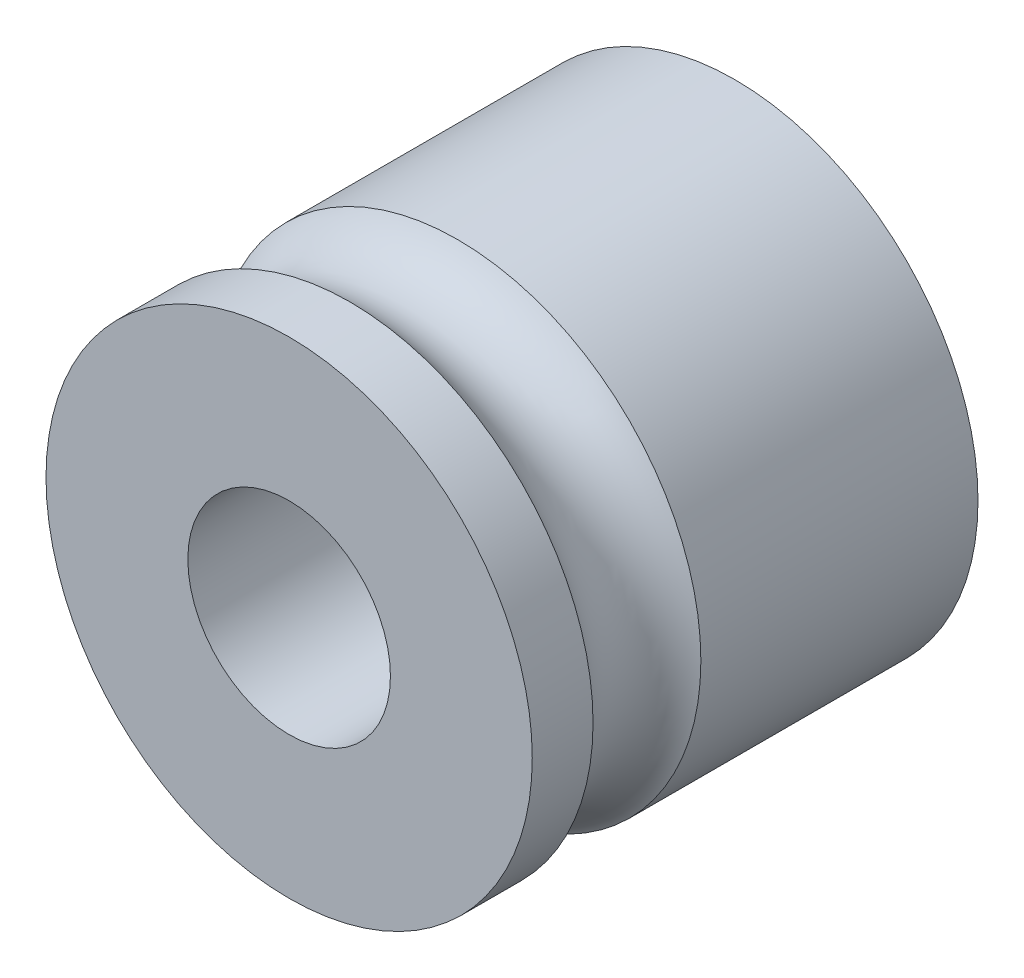
ISO-10303-21;
HEADER;
FILE_DESCRIPTION(('STEP AP214'),'2;1');
FILE_NAME('part.step','',(''),(''),'','','');
FILE_SCHEMA(('AUTOMOTIVE_DESIGN { 1 0 10303 214 1 1 1 1 }'));
ENDSEC;
DATA;
#1=APPLICATION_CONTEXT('core data for automotive mechanical design processes');
#2=APPLICATION_PROTOCOL_DEFINITION('international standard','automotive_design',2000,#1);
#3=PRODUCT_CONTEXT('',#1,'mechanical');
#4=PRODUCT('Part','Part','',(#3));
#5=PRODUCT_RELATED_PRODUCT_CATEGORY('part','',(#4));
#6=PRODUCT_DEFINITION_FORMATION('','',#4);
#7=PRODUCT_DEFINITION_CONTEXT('part definition',#1,'design');
#8=PRODUCT_DEFINITION('design','',#6,#7);
#9=PRODUCT_DEFINITION_SHAPE('','',#8);
#10=(LENGTH_UNIT() NAMED_UNIT(*) SI_UNIT(.MILLI.,.METRE.));
#11=(NAMED_UNIT(*) PLANE_ANGLE_UNIT() SI_UNIT($,.RADIAN.));
#12=(NAMED_UNIT(*) SI_UNIT($,.STERADIAN.) SOLID_ANGLE_UNIT());
#13=UNCERTAINTY_MEASURE_WITH_UNIT(LENGTH_MEASURE(1.E-05),#10,'distance_accuracy_value','');
#14=(GEOMETRIC_REPRESENTATION_CONTEXT(3) GLOBAL_UNCERTAINTY_ASSIGNED_CONTEXT((#13)) GLOBAL_UNIT_ASSIGNED_CONTEXT((#10,
#11,#12)) REPRESENTATION_CONTEXT('',''));
#15=CARTESIAN_POINT('',(0.,0.,0.));
#16=DIRECTION('',(0.,0.,1.));
#17=DIRECTION('',(1.,0.,0.));
#18=AXIS2_PLACEMENT_3D('',#15,#16,#17);
#19=CARTESIAN_POINT('',(0.,0.,11.));
#20=DIRECTION('',(0.,0.,-1.));
#21=DIRECTION('',(-1.,0.,0.));
#22=AXIS2_PLACEMENT_3D('',#19,#20,#21);
#23=CYLINDRICAL_SURFACE('',#22,6.);
#24=CARTESIAN_POINT('',(-6.,0.,4.20987199118622));
#25=CARTESIAN_POINT('',(-5.99999859868013,-0.0828760886697311,4.20986966544806));
#26=CARTESIAN_POINT('',(-5.99826578131828,-0.165778157830763,4.20298044041243));
#27=CARTESIAN_POINT('',(-5.99152113829892,-0.329206323770533,4.17564683987921));
#28=CARTESIAN_POINT('',(-5.98650745419968,-0.409731046870739,4.15519478164837));
#29=CARTESIAN_POINT('',(-5.9737562633204,-0.566020872182577,4.10143273772413));
#30=CARTESIAN_POINT('',(-5.96602202842087,-0.641791563430003,4.06813819247094));
#31=CARTESIAN_POINT('',(-5.94865343807593,-0.786672131904427,3.98969060114139));
#32=CARTESIAN_POINT('',(-5.9390190185405,-0.85578178434876,3.94453715506728));
#33=CARTESIAN_POINT('',(-5.91867413591801,-0.98680192730092,3.84267120153201));
#34=CARTESIAN_POINT('',(-5.90794707148533,-1.04855569006107,3.78576041622704));
#35=CARTESIAN_POINT('',(-5.8867362011753,-1.1617489272033,3.6624197862773));
#36=CARTESIAN_POINT('',(-5.87625242288348,-1.21318723694913,3.59598886823972));
#37=CARTESIAN_POINT('',(-5.8565477569971,-1.30502654279903,3.45427676444878));
#38=CARTESIAN_POINT('',(-5.84734794470605,-1.34525221592536,3.37887876037582));
#39=CARTESIAN_POINT('',(-5.83149494812223,-1.41239690855053,3.22212357952786));
#40=CARTESIAN_POINT('',(-5.82484135672789,-1.43931805543933,3.14076735786046));
#41=CARTESIAN_POINT('',(-5.81500476717551,-1.47855483680429,2.97612849298374));
#42=CARTESIAN_POINT('',(-5.81175491075426,-1.49115226833334,2.89291709513642));
#43=CARTESIAN_POINT('',(-5.80889362537741,-1.50226177506785,2.72550342217224));
#44=CARTESIAN_POINT('',(-5.80928160448644,-1.50077614181798,2.64130131048761));
#45=CARTESIAN_POINT('',(-5.81359205496618,-1.48398652463928,2.47645618344174));
#46=CARTESIAN_POINT('',(-5.81742863001879,-1.46901834019052,2.39577636972112));
#47=CARTESIAN_POINT('',(-5.82806709676484,-1.42622418690311,2.23811094027493));
#48=CARTESIAN_POINT('',(-5.83486919970696,-1.39839730206942,2.16112558815723));
#49=CARTESIAN_POINT('',(-5.85075113904187,-1.33038947793715,2.01213397493415));
#50=CARTESIAN_POINT('',(-5.85985327469421,-1.29008666723291,1.94018581939667));
#51=CARTESIAN_POINT('',(-5.87929710846386,-1.19835627601495,1.80395328142938));
#52=CARTESIAN_POINT('',(-5.88963902334735,-1.14692674880884,1.73967024311896));
#53=CARTESIAN_POINT('',(-5.91075880539781,-1.03266342468122,1.61866837549182));
#54=CARTESIAN_POINT('',(-5.92154069477971,-0.969546258165859,1.56221750112487));
#55=CARTESIAN_POINT('',(-5.94205965578786,-0.8346119175037,1.46065074872231));
#56=CARTESIAN_POINT('',(-5.95179669549415,-0.762794477707943,1.41553521692265));
#57=CARTESIAN_POINT('',(-5.96917732094183,-0.612115888681391,1.33782140496183));
#58=CARTESIAN_POINT('',(-5.97681360127725,-0.533231393208623,1.30526665093179));
#59=CARTESIAN_POINT('',(-5.98907916991419,-0.370876008142883,1.25395468547665));
#60=CARTESIAN_POINT('',(-5.99370903339281,-0.287405999150484,1.23519483476808));
#61=CARTESIAN_POINT('',(-5.99935499271375,-0.120539970390026,1.21241442562738));
#62=CARTESIAN_POINT('',(-6.00046053508279,-0.0371967199882089,1.20802896511092));
#63=CARTESIAN_POINT('',(-5.99918804814451,0.129032874801509,1.21312099324171));
#64=CARTESIAN_POINT('',(-5.99681033241847,0.211919259644596,1.22259723398535));
#65=CARTESIAN_POINT('',(-5.98889581127357,0.373614268776492,1.2548428995776));
#66=CARTESIAN_POINT('',(-5.98340634185811,0.452465118968755,1.27741325466321));
#67=CARTESIAN_POINT('',(-5.96988706634134,0.605257292452512,1.33497907521467));
#68=CARTESIAN_POINT('',(-5.96185700369892,0.679198119032635,1.36997579549939));
#69=CARTESIAN_POINT('',(-5.94393307926311,0.821523134429848,1.45210812006095));
#70=CARTESIAN_POINT('',(-5.93400867366932,0.889785441835831,1.49944810358298));
#71=CARTESIAN_POINT('',(-5.91344509187419,1.01752661364325,1.60466189998319));
#72=CARTESIAN_POINT('',(-5.90280579251705,1.07700395897301,1.66253753080313));
#73=CARTESIAN_POINT('',(-5.88168956960771,1.18699056807273,1.78887395203068));
#74=CARTESIAN_POINT('',(-5.87122304187281,1.23724386762203,1.85755969418864));
#75=CARTESIAN_POINT('',(-5.85192878377239,1.3255107590127,2.00260462565194));
#76=CARTESIAN_POINT('',(-5.84310098067026,1.36352489415794,2.07896347414597));
#77=CARTESIAN_POINT('',(-5.82818094734665,1.42595142060929,2.2367777135993));
#78=CARTESIAN_POINT('',(-5.82207255291906,1.45044439665407,2.31819961953023));
#79=CARTESIAN_POINT('',(-5.81326744090184,1.48534565995378,2.48418162907533));
#80=CARTESIAN_POINT('',(-5.81056997719936,1.49575702747866,2.56874104221871));
#81=CARTESIAN_POINT('',(-5.80894901203957,1.50203859033399,2.73599301504142));
#82=CARTESIAN_POINT('',(-5.80991932728264,1.49831789778012,2.81866942631095));
#83=CARTESIAN_POINT('',(-5.81527909007843,1.47737727831287,2.9821758798542));
#84=CARTESIAN_POINT('',(-5.81966846891857,1.46015762268677,3.06300595919987));
#85=CARTESIAN_POINT('',(-5.83131260682723,1.41293131944279,3.22008045025163));
#86=CARTESIAN_POINT('',(-5.8385501523631,1.38300140468038,3.29634929642643));
#87=CARTESIAN_POINT('',(-5.85507755724829,1.31126491360507,3.44283737389991));
#88=CARTESIAN_POINT('',(-5.86436770120773,1.26945669003419,3.51305576437314));
#89=CARTESIAN_POINT('',(-5.88425634263512,1.17386774863714,3.64742662018824));
#90=CARTESIAN_POINT('',(-5.89488264831757,1.11980316291225,3.71137306461018));
#91=CARTESIAN_POINT('',(-5.91608027246286,1.00178937118973,3.82941903598163));
#92=CARTESIAN_POINT('',(-5.9266515772706,0.937837821261145,3.88351622129919));
#93=CARTESIAN_POINT('',(-5.94677655647663,0.800467586702589,3.98128329975083));
#94=CARTESIAN_POINT('',(-5.95630833365868,0.726898422316385,4.0247466048578));
#95=CARTESIAN_POINT('',(-5.97304924975118,0.573266059510474,4.09861945412675));
#96=CARTESIAN_POINT('',(-5.98026005199781,0.493207563436738,4.12903835183476));
#97=CARTESIAN_POINT('',(-5.99048059565542,0.34441025324347,4.17144382151587));
#98=CARTESIAN_POINT('',(-5.99402585052691,0.276380170908067,4.18582323423965));
#99=CARTESIAN_POINT('',(-5.99878605231948,0.138906071536282,4.20503793480816));
#100=CARTESIAN_POINT('',(-6.00000117450894,0.0694621612426158,4.20987394049152));
#101=CARTESIAN_POINT('',(-6.,0.,4.20987199118622));
#102=B_SPLINE_CURVE_WITH_KNOTS('',3,(#24,#25,#26,#27,#28,#29,#30,#31,#32,#33,#34,#35,#36,#37,
#38,#39,#40,#41,#42,#43,#44,#45,#46,#47,#48,#49,#50,#51,#52,#53,#54,#55,#56,#57,#58,#59,#60,#61,
#62,#63,#64,#65,#66,#67,#68,#69,#70,#71,#72,#73,#74,#75,#76,#77,#78,#79,#80,#81,#82,#83,#84,#85,
#86,#87,#88,#89,#90,#91,#92,#93,#94,#95,#96,#97,#98,#99,#100,#101),.UNSPECIFIED.,.T.,.F.,(4,2,2,
2,2,2,2,2,2,2,2,2,2,2,2,2,2,2,2,2,2,2,2,2,2,2,2,2,2,2,2,2,2,2,2,2,2,2,4),(0.,0.24837371247189,
0.4968882377639,0.745104902286106,0.993329940169328,1.24614435437139,1.49898729580062,
1.75558647545807,2.01214461169368,2.2635629509943,2.51494038112697,2.76022497007018,
3.00552703466038,3.25330527873879,3.50112690836163,3.75601500969019,4.01091089558247,
4.26668229009114,4.52240473688643,4.77158308949276,5.02073901112743,5.26620274514037,
5.5116912732229,5.76153587565352,6.01142363008019,6.26744509204476,6.52345518749508,
6.77792254614037,7.03233423252408,7.27943780398613,7.52653640956034,7.77216400559447,
8.01782568136901,8.2698957640991,8.52202569770418,8.77872185499588,9.0352336382135,
9.24342242942149,9.4515955604304),.UNSPECIFIED.);
#103=CARTESIAN_POINT('',(-6.,0.,4.20987199118622));
#104=VERTEX_POINT('',#103);
#105=EDGE_CURVE('E73',#104,#104,#102,.T.);
#106=ORIENTED_EDGE('',*,*,#105,.T.);
#107=EDGE_LOOP('',(#106));
#108=FACE_BOUND('',#107,.T.);
#109=CARTESIAN_POINT('',(0.,0.,6.83891077757858));
#110=DIRECTION('',(0.,0.,-1.));
#111=DIRECTION('',(-1.,0.,0.));
#112=AXIS2_PLACEMENT_3D('',#109,#110,#111);
#113=CIRCLE('',#112,6.);
#114=CARTESIAN_POINT('',(-6.,0.,6.83891077757858));
#115=VERTEX_POINT('',#114);
#116=EDGE_CURVE('E65',#115,#115,#113,.T.);
#117=ORIENTED_EDGE('',*,*,#116,.T.);
#118=EDGE_LOOP('',(#117));
#119=FACE_BOUND('',#118,.T.);
#120=CARTESIAN_POINT('',(0.,0.,0.));
#121=DIRECTION('',(0.,0.,1.));
#122=DIRECTION('',(1.,0.,0.));
#123=AXIS2_PLACEMENT_3D('',#120,#121,#122);
#124=CIRCLE('',#123,6.);
#125=CARTESIAN_POINT('',(6.,0.,0.));
#126=VERTEX_POINT('',#125);
#127=EDGE_CURVE('E55',#126,#126,#124,.T.);
#128=ORIENTED_EDGE('',*,*,#127,.T.);
#129=EDGE_LOOP('',(#128));
#130=FACE_BOUND('',#129,.T.);
#131=ADVANCED_FACE('F42',(#108,#119,#130),#23,.T.);
#132=CARTESIAN_POINT('',(0.,0.,11.));
#133=DIRECTION('',(0.,0.,1.));
#134=DIRECTION('',(1.,0.,0.));
#135=AXIS2_PLACEMENT_3D('',#132,#133,#134);
#136=PLANE('',#135);
#137=CARTESIAN_POINT('',(0.,0.,11.));
#138=DIRECTION('',(0.,0.,1.));
#139=DIRECTION('',(1.,0.,0.));
#140=AXIS2_PLACEMENT_3D('',#137,#138,#139);
#141=CIRCLE('',#140,6.);
#142=CARTESIAN_POINT('',(6.,0.,11.));
#143=VERTEX_POINT('',#142);
#144=EDGE_CURVE('E12',#143,#143,#141,.T.);
#145=ORIENTED_EDGE('',*,*,#144,.T.);
#146=EDGE_LOOP('',(#145));
#147=FACE_BOUND('',#146,.T.);
#148=CARTESIAN_POINT('',(0.,0.,11.));
#149=DIRECTION('',(0.,0.,1.));
#150=DIRECTION('',(1.,0.,0.));
#151=AXIS2_PLACEMENT_3D('',#148,#149,#150);
#152=CIRCLE('',#151,2.5);
#153=CARTESIAN_POINT('',(2.5,0.,11.));
#154=VERTEX_POINT('',#153);
#155=EDGE_CURVE('E60',#154,#154,#152,.T.);
#156=ORIENTED_EDGE('',*,*,#155,.F.);
#157=EDGE_LOOP('',(#156));
#158=FACE_BOUND('',#157,.T.);
#159=ADVANCED_FACE('F91',(#147,#158),#136,.T.);
#160=CARTESIAN_POINT('',(0.,0.,0.));
#161=DIRECTION('',(0.,0.,1.));
#162=DIRECTION('',(1.,0.,0.));
#163=AXIS2_PLACEMENT_3D('',#160,#161,#162);
#164=PLANE('',#163);
#165=ORIENTED_EDGE('',*,*,#127,.F.);
#166=EDGE_LOOP('',(#165));
#167=FACE_BOUND('',#166,.T.);
#168=CARTESIAN_POINT('',(0.,0.,0.));
#169=DIRECTION('',(0.,0.,1.));
#170=DIRECTION('',(1.,0.,0.));
#171=AXIS2_PLACEMENT_3D('',#168,#169,#170);
#172=CIRCLE('',#171,2.5);
#173=CARTESIAN_POINT('',(2.5,0.,0.));
#174=VERTEX_POINT('',#173);
#175=EDGE_CURVE('E62',#174,#174,#172,.T.);
#176=ORIENTED_EDGE('',*,*,#175,.T.);
#177=EDGE_LOOP('',(#176));
#178=FACE_BOUND('',#177,.T.);
#179=ADVANCED_FACE('F93',(#167,#178),#164,.F.);
#180=CARTESIAN_POINT('',(0.,0.,9.5));
#181=DIRECTION('',(0.,0.,-1.));
#182=DIRECTION('',(-1.,0.,0.));
#183=AXIS2_PLACEMENT_3D('',#180,#181,#182);
#184=CIRCLE('',#183,6.);
#185=CARTESIAN_POINT('',(-6.,0.,9.5));
#186=VERTEX_POINT('',#185);
#187=EDGE_CURVE('E70',#186,#186,#184,.T.);
#188=ORIENTED_EDGE('',*,*,#187,.F.);
#189=EDGE_LOOP('',(#188));
#190=FACE_BOUND('',#189,.T.);
#191=ORIENTED_EDGE('',*,*,#144,.F.);
#192=EDGE_LOOP('',(#191));
#193=FACE_BOUND('',#192,.T.);
#194=ADVANCED_FACE('F44',(#190,#193),#23,.T.);
#195=CARTESIAN_POINT('',(0.,0.,11.));
#196=DIRECTION('',(0.,0.,-1.));
#197=DIRECTION('',(-1.,0.,0.));
#198=AXIS2_PLACEMENT_3D('',#195,#196,#197);
#199=CYLINDRICAL_SURFACE('',#198,2.5);
#200=CARTESIAN_POINT('',(-2.5,0.,4.20987199118622));
#201=CARTESIAN_POINT('',(-2.49999625789732,-0.0767298334620158,4.20986790017634));
#202=CARTESIAN_POINT('',(-2.4964290461501,-0.153582320644178,4.20394332025995));
#203=CARTESIAN_POINT('',(-2.48249903608568,-0.304975509530679,4.18054767167089));
#204=CARTESIAN_POINT('',(-2.47211948032719,-0.379510034596047,4.16304812933199));
#205=CARTESIAN_POINT('',(-2.44561558054488,-0.523751827790837,4.11748563001936));
#206=CARTESIAN_POINT('',(-2.42951973272944,-0.593481028226566,4.08947503302306));
#207=CARTESIAN_POINT('',(-2.39295367626407,-0.727030318214658,4.02401165804519));
#208=CARTESIAN_POINT('',(-2.37248455380255,-0.790851869416383,3.98656122421747));
#209=CARTESIAN_POINT('',(-2.32705360719088,-0.916299278999315,3.90009716447764));
#210=CARTESIAN_POINT('',(-2.30186792195985,-0.977384020081415,3.85041829583483));
#211=CARTESIAN_POINT('',(-2.25030439279634,-1.09088270411891,3.74240478735795));
#212=CARTESIAN_POINT('',(-2.22392505153571,-1.14328534948112,3.6840590539989));
#213=CARTESIAN_POINT('',(-2.1691106699591,-1.24444996762974,3.55194848068949));
#214=CARTESIAN_POINT('',(-2.14082017703649,-1.29197766378809,3.47717022020493));
#215=CARTESIAN_POINT('',(-2.08938301412124,-1.37361437764896,3.3190254179431));
#216=CARTESIAN_POINT('',(-2.06622802273938,-1.4077451733516,3.23567309493865));
#217=CARTESIAN_POINT('',(-2.0335462966093,-1.45440601714221,3.08327554053298));
#218=CARTESIAN_POINT('',(-2.02207883137591,-1.47016197246826,3.0156359925759));
#219=CARTESIAN_POINT('',(-2.00590308295503,-1.49216172340475,2.87806827535585));
#220=CARTESIAN_POINT('',(-2.00118639643759,-1.49841734556836,2.80814306243172));
#221=CARTESIAN_POINT('',(-1.99920922463856,-1.50105508796009,2.66786049696888));
#222=CARTESIAN_POINT('',(-2.00196337012718,-1.49741783408419,2.59750256609302));
#223=CARTESIAN_POINT('',(-2.01453261443741,-1.48046060478828,2.45859321575863));
#224=CARTESIAN_POINT('',(-2.02435302432226,-1.46713334620103,2.39004319533877));
#225=CARTESIAN_POINT('',(-2.04953186944258,-1.43173921881792,2.25734174905811));
#226=CARTESIAN_POINT('',(-2.06481711652537,-1.40978748666087,2.19314493726174));
#227=CARTESIAN_POINT('',(-2.09927051350828,-1.35795061770837,2.0691770002581));
#228=CARTESIAN_POINT('',(-2.11844008623465,-1.32806257259705,2.00940750776229));
#229=CARTESIAN_POINT('',(-2.16255327268985,-1.25517983184583,1.88488789406342));
#230=CARTESIAN_POINT('',(-2.18792043372992,-1.21080724397723,1.82109389823129));
#231=CARTESIAN_POINT('',(-2.23930599764381,-1.11291092784003,1.7011955075192));
#232=CARTESIAN_POINT('',(-2.26532500262149,-1.05937845100578,1.64509855720971));
#233=CARTESIAN_POINT('',(-2.31935504958317,-0.935811834382965,1.53425900936446));
#234=CARTESIAN_POINT('',(-2.34713836268532,-0.864517682704956,1.48079468517023));
#235=CARTESIAN_POINT('',(-2.39772428433981,-0.712276050458999,1.38674994398831));
#236=CARTESIAN_POINT('',(-2.42052955425515,-0.631333763943563,1.34616263739627));
#237=CARTESIAN_POINT('',(-2.45730392066151,-0.467197585268205,1.28193980839032));
#238=CARTESIAN_POINT('',(-2.47173957439704,-0.384467624173579,1.2573966354703));
#239=CARTESIAN_POINT('',(-2.49218842813551,-0.215047895144639,1.22286079378084));
#240=CARTESIAN_POINT('',(-2.49821172952738,-0.128363005661319,1.21285067343264));
#241=CARTESIAN_POINT('',(-2.5009057037461,0.0337146143773968,1.20836414350791));
#242=CARTESIAN_POINT('',(-2.49873521714286,0.109042473418718,1.21196313610105));
#243=CARTESIAN_POINT('',(-2.48778712087048,0.257829401986061,1.23029784425814));
#244=CARTESIAN_POINT('',(-2.47900964518037,0.331288509376106,1.24503333399203));
#245=CARTESIAN_POINT('',(-2.4559479244219,0.472574932157613,1.28441542399868));
#246=CARTESIAN_POINT('',(-2.44180275662555,0.540495750928484,1.30881234025969));
#247=CARTESIAN_POINT('',(-2.40913880862844,0.671265749087263,1.36654936755149));
#248=CARTESIAN_POINT('',(-2.39061916586511,0.734113924963909,1.39989124253289));
#249=CARTESIAN_POINT('',(-2.3484549623736,0.860006262823864,1.47842897039492));
#250=CARTESIAN_POINT('',(-2.3244780273988,0.922394150456837,1.52449582026461));
#251=CARTESIAN_POINT('',(-2.27474265574731,1.03902603131014,1.62526338467484));
#252=CARTESIAN_POINT('',(-2.2489821658636,1.09326040273738,1.67997414603875));
#253=CARTESIAN_POINT('',(-2.19445423909891,1.19931996735579,1.80478238122337));
#254=CARTESIAN_POINT('',(-2.16573241746291,1.24991019630915,1.87595587665172));
#255=CARTESIAN_POINT('',(-2.1121618206671,1.33845238915668,2.02708801575442));
#256=CARTESIAN_POINT('',(-2.0873089799769,1.37641766769781,2.107037285079));
#257=CARTESIAN_POINT('',(-2.04984909240519,1.43142578795776,2.25611501349291));
#258=CARTESIAN_POINT('',(-2.03575659328729,1.4512162533619,2.32385230354481));
#259=CARTESIAN_POINT('',(-2.01409605743544,1.48113663905972,2.46240406926632));
#260=CARTESIAN_POINT('',(-2.00651897642721,1.49127995297631,2.53321413551405));
#261=CARTESIAN_POINT('',(-1.99900446616268,1.50134130416631,2.67624893878325));
#262=CARTESIAN_POINT('',(-1.99909576445937,1.50122089107869,2.74847798187326));
#263=CARTESIAN_POINT('',(-2.0069771789285,1.49066472959328,2.89176642679568));
#264=CARTESIAN_POINT('',(-2.0147714813882,1.48022337215759,2.96282517126681));
#265=CARTESIAN_POINT('',(-2.0363318524298,1.45040174148913,3.09836040875841));
#266=CARTESIAN_POINT('',(-2.04979211805581,1.43147636845351,3.16298908549309));
#267=CARTESIAN_POINT('',(-2.08105501960151,1.38563242076993,3.28820924566043));
#268=CARTESIAN_POINT('',(-2.09885929040482,1.35871083588479,3.34879919814677));
#269=CARTESIAN_POINT('',(-2.14012990550917,1.29289245555732,3.474191848407));
#270=CARTESIAN_POINT('',(-2.16404587582639,1.25279167675753,3.53821309504053));
#271=CARTESIAN_POINT('',(-2.21320127030768,1.16375698389085,3.65925206380351));
#272=CARTESIAN_POINT('',(-2.23844177205021,1.11481579607798,3.71626395333877));
#273=CARTESIAN_POINT('',(-2.29225690291476,1.00009777425734,3.83122294031789));
#274=CARTESIAN_POINT('',(-2.32070308663658,0.932876819313905,3.88780306608241));
#275=CARTESIAN_POINT('',(-2.37365428872367,0.788462434445589,3.98896984704953));
#276=CARTESIAN_POINT('',(-2.39815789310936,0.71126544450154,4.03355220317101));
#277=CARTESIAN_POINT('',(-2.43985578654394,0.551125230801454,4.10765779875996));
#278=CARTESIAN_POINT('',(-2.45725077479787,0.468430086957215,4.13760005611305));
#279=CARTESIAN_POINT('',(-2.48366273001246,0.297973306118809,4.18259668639719));
#280=CARTESIAN_POINT('',(-2.49271125871485,0.210232099648613,4.19770715904321));
#281=CARTESIAN_POINT('',(-2.49802001168187,0.101558096917537,4.20656944589488));
#282=CARTESIAN_POINT('',(-2.49876114656362,0.081276259028278,4.20780640849231));
#283=CARTESIAN_POINT('',(-2.49975164517367,0.0406658206871126,4.20945823755708));
#284=CARTESIAN_POINT('',(-2.50000099184316,0.0203372186375696,4.20987307550712));
#285=CARTESIAN_POINT('',(-2.5,0.,4.20987199118622));
#286=B_SPLINE_CURVE_WITH_KNOTS('',3,(#200,#201,#202,#203,#204,#205,#206,#207,#208,#209,#210,
#211,#212,#213,#214,#215,#216,#217,#218,#219,#220,#221,#222,#223,#224,#225,#226,#227,#228,#229,
#230,#231,#232,#233,#234,#235,#236,#237,#238,#239,#240,#241,#242,#243,#244,#245,#246,#247,#248,
#249,#250,#251,#252,#253,#254,#255,#256,#257,#258,#259,#260,#261,#262,#263,#264,#265,#266,#267,
#268,#269,#270,#271,#272,#273,#274,#275,#276,#277,#278,#279,#280,#281,#282,#283,#284,#285),
.UNSPECIFIED.,.T.,.F.,(4,2,2,2,2,2,2,2,2,2,2,2,2,2,2,2,2,2,2,2,2,2,2,2,2,2,2,2,2,2,2,2,2,2,2,2,
2,2,2,2,2,2,4),(0.,0.230102237548649,0.460772627520012,0.690308884600011,0.919788197992275,
1.16681590732473,1.41416257934801,1.69183813189807,1.96906040692092,2.17933829855633,
2.38935420916578,2.59978170870726,2.81036753273872,3.01823267593207,3.22617409809868,
3.47046995225163,3.71500044803674,3.99360957884691,4.27206939275324,4.53296790696559,
4.79355286918236,5.01875602722426,5.24395461863455,5.46367785689772,5.68344445659025,
5.92601365818362,6.16886690081836,6.44336762428009,6.71757792616456,6.93257787314692,
7.14727888733318,7.36278425777433,7.57840681155725,7.78364098331142,7.98895251523035,
8.22578610052286,8.46281544370208,8.73854311775519,9.01436946031985,9.28175654462677,
9.54812832184448,9.60911473335177,9.6701032602764),.UNSPECIFIED.);
#287=CARTESIAN_POINT('',(-2.5,0.,4.20987199118622));
#288=VERTEX_POINT('',#287);
#289=EDGE_CURVE('E47',#288,#288,#286,.T.);
#290=ORIENTED_EDGE('',*,*,#289,.F.);
#291=EDGE_LOOP('',(#290));
#292=FACE_BOUND('',#291,.T.);
#293=ORIENTED_EDGE('',*,*,#155,.T.);
#294=EDGE_LOOP('',(#293));
#295=FACE_BOUND('',#294,.T.);
#296=ORIENTED_EDGE('',*,*,#175,.F.);
#297=EDGE_LOOP('',(#296));
#298=FACE_BOUND('',#297,.T.);
#299=ADVANCED_FACE('F85',(#292,#295,#298),#199,.F.);
#300=CARTESIAN_POINT('',(0.,0.,8.16945538878929));
#301=DIRECTION('',(0.,0.,-1.));
#302=DIRECTION('',(-1.,0.,0.));
#303=AXIS2_PLACEMENT_3D('',#300,#301,#302);
#304=TOROIDAL_SURFACE('',#303,6.80523264161457,1.55523264161457);
#305=ORIENTED_EDGE('',*,*,#116,.F.);
#306=EDGE_LOOP('',(#305));
#307=FACE_BOUND('',#306,.T.);
#308=ORIENTED_EDGE('',*,*,#187,.T.);
#309=EDGE_LOOP('',(#308));
#310=FACE_BOUND('',#309,.T.);
#311=ADVANCED_FACE('F81',(#307,#310),#304,.F.);
#312=CARTESIAN_POINT('',(-11.,0.,2.70987199118622));
#313=DIRECTION('',(1.,0.,0.));
#314=DIRECTION('',(0.,0.,-1.));
#315=AXIS2_PLACEMENT_3D('',#312,#313,#314);
#316=CYLINDRICAL_SURFACE('',#315,1.5);
#317=ORIENTED_EDGE('',*,*,#289,.T.);
#318=EDGE_LOOP('',(#317));
#319=FACE_BOUND('',#318,.T.);
#320=ORIENTED_EDGE('',*,*,#105,.F.);
#321=EDGE_LOOP('',(#320));
#322=FACE_BOUND('',#321,.T.);
#323=ADVANCED_FACE('F77',(#319,#322),#316,.F.);
#324=CLOSED_SHELL('',(#131,#159,#179,#194,#299,#311,#323));
#325=MANIFOLD_SOLID_BREP('B2',#324);
#326=ADVANCED_BREP_SHAPE_REPRESENTATION('',(#18,#325),#14);
#327=SHAPE_DEFINITION_REPRESENTATION(#9,#326);
ENDSEC;
END-ISO-10303-21;
